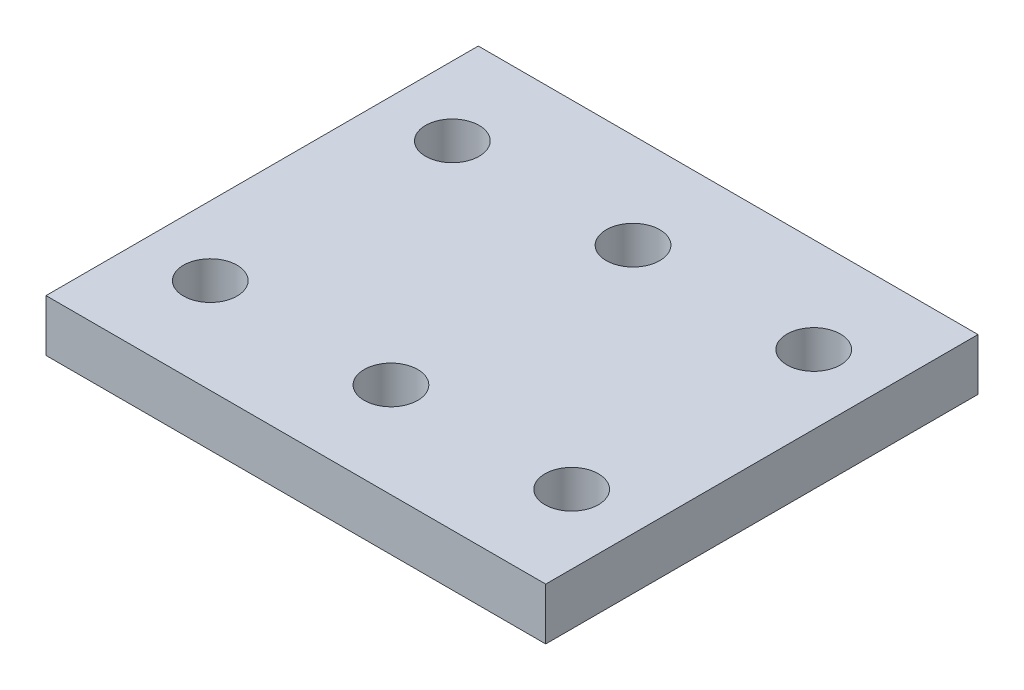
ISO-10303-21;
HEADER;
FILE_DESCRIPTION(('STEP AP214'),'2;1');
FILE_NAME('part.step','',(''),(''),'','','');
FILE_SCHEMA(('AUTOMOTIVE_DESIGN { 1 0 10303 214 1 1 1 1 }'));
ENDSEC;
DATA;
#1=APPLICATION_CONTEXT('core data for automotive mechanical design processes');
#2=APPLICATION_PROTOCOL_DEFINITION('international standard','automotive_design',2000,#1);
#3=PRODUCT_CONTEXT('',#1,'mechanical');
#4=PRODUCT('Part','Part','',(#3));
#5=PRODUCT_RELATED_PRODUCT_CATEGORY('part','',(#4));
#6=PRODUCT_DEFINITION_FORMATION('','',#4);
#7=PRODUCT_DEFINITION_CONTEXT('part definition',#1,'design');
#8=PRODUCT_DEFINITION('design','',#6,#7);
#9=PRODUCT_DEFINITION_SHAPE('','',#8);
#10=(LENGTH_UNIT() NAMED_UNIT(*) SI_UNIT(.MILLI.,.METRE.));
#11=(NAMED_UNIT(*) PLANE_ANGLE_UNIT() SI_UNIT($,.RADIAN.));
#12=(NAMED_UNIT(*) SI_UNIT($,.STERADIAN.) SOLID_ANGLE_UNIT());
#13=UNCERTAINTY_MEASURE_WITH_UNIT(LENGTH_MEASURE(1.E-05),#10,'distance_accuracy_value','');
#14=(GEOMETRIC_REPRESENTATION_CONTEXT(3) GLOBAL_UNCERTAINTY_ASSIGNED_CONTEXT((#13)) GLOBAL_UNIT_ASSIGNED_CONTEXT((#10,
#11,#12)) REPRESENTATION_CONTEXT('',''));
#15=CARTESIAN_POINT('',(0.,0.,0.));
#16=DIRECTION('',(0.,0.,1.));
#17=DIRECTION('',(1.,0.,0.));
#18=AXIS2_PLACEMENT_3D('',#15,#16,#17);
#19=CARTESIAN_POINT('',(0.,3.,0.));
#20=DIRECTION('',(0.,1.,0.));
#21=DIRECTION('',(0.,0.,1.));
#22=AXIS2_PLACEMENT_3D('',#19,#20,#21);
#23=PLANE('',#22);
#24=CARTESIAN_POINT('',(0.,3.,-7.));
#25=DIRECTION('',(0.,1.,0.));
#26=DIRECTION('',(0.,0.,1.));
#27=AXIS2_PLACEMENT_3D('',#24,#25,#26);
#28=CIRCLE('',#27,1.55);
#29=CARTESIAN_POINT('',(0.,3.,-5.45));
#30=VERTEX_POINT('',#29);
#31=EDGE_CURVE('E134',#30,#30,#28,.T.);
#32=ORIENTED_EDGE('',*,*,#31,.F.);
#33=EDGE_LOOP('',(#32));
#34=FACE_BOUND('',#33,.T.);
#35=CARTESIAN_POINT('',(-10.45,3.,7.));
#36=DIRECTION('',(0.,1.,0.));
#37=DIRECTION('',(0.,0.,1.));
#38=AXIS2_PLACEMENT_3D('',#35,#36,#37);
#39=CIRCLE('',#38,1.55);
#40=CARTESIAN_POINT('',(-10.45,3.,8.55));
#41=VERTEX_POINT('',#40);
#42=EDGE_CURVE('E122',#41,#41,#39,.T.);
#43=ORIENTED_EDGE('',*,*,#42,.F.);
#44=EDGE_LOOP('',(#43));
#45=FACE_BOUND('',#44,.T.);
#46=CARTESIAN_POINT('',(10.45,3.,-7.));
#47=DIRECTION('',(0.,1.,0.));
#48=DIRECTION('',(0.,0.,1.));
#49=AXIS2_PLACEMENT_3D('',#46,#47,#48);
#50=CIRCLE('',#49,1.55);
#51=CARTESIAN_POINT('',(10.45,3.,-5.45));
#52=VERTEX_POINT('',#51);
#53=EDGE_CURVE('E101',#52,#52,#50,.T.);
#54=ORIENTED_EDGE('',*,*,#53,.F.);
#55=EDGE_LOOP('',(#54));
#56=FACE_BOUND('',#55,.T.);
#57=DIRECTION('',(0.,0.,1.));
#58=VECTOR('',#57,1.);
#59=CARTESIAN_POINT('',(-14.45,3.,12.5));
#60=LINE('',#59,#58);
#61=CARTESIAN_POINT('',(-14.45,3.,-12.5));
#62=VERTEX_POINT('',#61);
#63=CARTESIAN_POINT('',(-14.45,3.,12.5));
#64=VERTEX_POINT('',#63);
#65=EDGE_CURVE('E86',#62,#64,#60,.T.);
#66=ORIENTED_EDGE('',*,*,#65,.T.);
#67=DIRECTION('',(1.,0.,0.));
#68=VECTOR('',#67,1.);
#69=CARTESIAN_POINT('',(14.45,3.,12.5));
#70=LINE('',#69,#68);
#71=CARTESIAN_POINT('',(14.45,3.,12.5));
#72=VERTEX_POINT('',#71);
#73=EDGE_CURVE('E81',#64,#72,#70,.T.);
#74=ORIENTED_EDGE('',*,*,#73,.T.);
#75=DIRECTION('',(0.,0.,-1.));
#76=VECTOR('',#75,1.);
#77=CARTESIAN_POINT('',(14.45,3.,12.5));
#78=LINE('',#77,#76);
#79=CARTESIAN_POINT('',(14.45,3.,-12.5));
#80=VERTEX_POINT('',#79);
#81=EDGE_CURVE('E84',#72,#80,#78,.T.);
#82=ORIENTED_EDGE('',*,*,#81,.T.);
#83=DIRECTION('',(-1.,0.,0.));
#84=VECTOR('',#83,1.);
#85=CARTESIAN_POINT('',(14.45,3.,-12.5));
#86=LINE('',#85,#84);
#87=EDGE_CURVE('E51',#80,#62,#86,.T.);
#88=ORIENTED_EDGE('',*,*,#87,.T.);
#89=EDGE_LOOP('',(#66,#74,#82,#88));
#90=FACE_BOUND('',#89,.T.);
#91=CARTESIAN_POINT('',(10.45,3.,7.));
#92=DIRECTION('',(0.,1.,0.));
#93=DIRECTION('',(0.,0.,1.));
#94=AXIS2_PLACEMENT_3D('',#91,#92,#93);
#95=CIRCLE('',#94,1.55);
#96=CARTESIAN_POINT('',(10.45,3.,8.55));
#97=VERTEX_POINT('',#96);
#98=EDGE_CURVE('E116',#97,#97,#95,.T.);
#99=ORIENTED_EDGE('',*,*,#98,.F.);
#100=EDGE_LOOP('',(#99));
#101=FACE_BOUND('',#100,.T.);
#102=CARTESIAN_POINT('',(-10.45,3.,-7.));
#103=DIRECTION('',(0.,1.,0.));
#104=DIRECTION('',(0.,0.,1.));
#105=AXIS2_PLACEMENT_3D('',#102,#103,#104);
#106=CIRCLE('',#105,1.55);
#107=CARTESIAN_POINT('',(-10.45,3.,-5.45));
#108=VERTEX_POINT('',#107);
#109=EDGE_CURVE('E128',#108,#108,#106,.T.);
#110=ORIENTED_EDGE('',*,*,#109,.F.);
#111=EDGE_LOOP('',(#110));
#112=FACE_BOUND('',#111,.T.);
#113=CARTESIAN_POINT('',(0.,3.,7.));
#114=DIRECTION('',(0.,1.,0.));
#115=DIRECTION('',(0.,0.,1.));
#116=AXIS2_PLACEMENT_3D('',#113,#114,#115);
#117=CIRCLE('',#116,1.55);
#118=CARTESIAN_POINT('',(0.,3.,8.55));
#119=VERTEX_POINT('',#118);
#120=EDGE_CURVE('E140',#119,#119,#117,.T.);
#121=ORIENTED_EDGE('',*,*,#120,.F.);
#122=EDGE_LOOP('',(#121));
#123=FACE_BOUND('',#122,.T.);
#124=ADVANCED_FACE('F34',(#34,#45,#56,#90,#101,#112,#123),#23,.T.);
#125=CARTESIAN_POINT('',(0.,0.,0.));
#126=DIRECTION('',(0.,1.,0.));
#127=DIRECTION('',(0.,0.,1.));
#128=AXIS2_PLACEMENT_3D('',#125,#126,#127);
#129=PLANE('',#128);
#130=DIRECTION('',(0.,0.,1.));
#131=VECTOR('',#130,1.);
#132=CARTESIAN_POINT('',(-14.45,0.,12.5));
#133=LINE('',#132,#131);
#134=CARTESIAN_POINT('',(-14.45,0.,-12.5));
#135=VERTEX_POINT('',#134);
#136=CARTESIAN_POINT('',(-14.45,0.,12.5));
#137=VERTEX_POINT('',#136);
#138=EDGE_CURVE('E98',#135,#137,#133,.T.);
#139=ORIENTED_EDGE('',*,*,#138,.F.);
#140=DIRECTION('',(-1.,0.,0.));
#141=VECTOR('',#140,1.);
#142=CARTESIAN_POINT('',(14.45,0.,-12.5));
#143=LINE('',#142,#141);
#144=CARTESIAN_POINT('',(14.45,0.,-12.5));
#145=VERTEX_POINT('',#144);
#146=EDGE_CURVE('E74',#145,#135,#143,.T.);
#147=ORIENTED_EDGE('',*,*,#146,.F.);
#148=DIRECTION('',(0.,0.,-1.));
#149=VECTOR('',#148,1.);
#150=CARTESIAN_POINT('',(14.45,0.,12.5));
#151=LINE('',#150,#149);
#152=CARTESIAN_POINT('',(14.45,0.,12.5));
#153=VERTEX_POINT('',#152);
#154=EDGE_CURVE('E68',#153,#145,#151,.T.);
#155=ORIENTED_EDGE('',*,*,#154,.F.);
#156=DIRECTION('',(1.,0.,0.));
#157=VECTOR('',#156,1.);
#158=CARTESIAN_POINT('',(14.45,0.,12.5));
#159=LINE('',#158,#157);
#160=EDGE_CURVE('E90',#137,#153,#159,.T.);
#161=ORIENTED_EDGE('',*,*,#160,.F.);
#162=EDGE_LOOP('',(#139,#147,#155,#161));
#163=FACE_BOUND('',#162,.T.);
#164=CARTESIAN_POINT('',(10.45,0.,-7.));
#165=DIRECTION('',(0.,1.,0.));
#166=DIRECTION('',(0.,0.,1.));
#167=AXIS2_PLACEMENT_3D('',#164,#165,#166);
#168=CIRCLE('',#167,1.55);
#169=CARTESIAN_POINT('',(10.45,0.,-5.45));
#170=VERTEX_POINT('',#169);
#171=EDGE_CURVE('E113',#170,#170,#168,.T.);
#172=ORIENTED_EDGE('',*,*,#171,.T.);
#173=EDGE_LOOP('',(#172));
#174=FACE_BOUND('',#173,.T.);
#175=CARTESIAN_POINT('',(10.45,0.,7.));
#176=DIRECTION('',(0.,1.,0.));
#177=DIRECTION('',(0.,0.,1.));
#178=AXIS2_PLACEMENT_3D('',#175,#176,#177);
#179=CIRCLE('',#178,1.55);
#180=CARTESIAN_POINT('',(10.45,0.,8.55));
#181=VERTEX_POINT('',#180);
#182=EDGE_CURVE('E119',#181,#181,#179,.T.);
#183=ORIENTED_EDGE('',*,*,#182,.T.);
#184=EDGE_LOOP('',(#183));
#185=FACE_BOUND('',#184,.T.);
#186=CARTESIAN_POINT('',(-10.45,0.,7.));
#187=DIRECTION('',(0.,1.,0.));
#188=DIRECTION('',(0.,0.,1.));
#189=AXIS2_PLACEMENT_3D('',#186,#187,#188);
#190=CIRCLE('',#189,1.55);
#191=CARTESIAN_POINT('',(-10.45,0.,8.55));
#192=VERTEX_POINT('',#191);
#193=EDGE_CURVE('E125',#192,#192,#190,.T.);
#194=ORIENTED_EDGE('',*,*,#193,.T.);
#195=EDGE_LOOP('',(#194));
#196=FACE_BOUND('',#195,.T.);
#197=CARTESIAN_POINT('',(-10.45,0.,-7.));
#198=DIRECTION('',(0.,1.,0.));
#199=DIRECTION('',(0.,0.,1.));
#200=AXIS2_PLACEMENT_3D('',#197,#198,#199);
#201=CIRCLE('',#200,1.55);
#202=CARTESIAN_POINT('',(-10.45,0.,-5.45));
#203=VERTEX_POINT('',#202);
#204=EDGE_CURVE('E131',#203,#203,#201,.T.);
#205=ORIENTED_EDGE('',*,*,#204,.T.);
#206=EDGE_LOOP('',(#205));
#207=FACE_BOUND('',#206,.T.);
#208=CARTESIAN_POINT('',(0.,0.,-7.));
#209=DIRECTION('',(0.,1.,0.));
#210=DIRECTION('',(0.,0.,1.));
#211=AXIS2_PLACEMENT_3D('',#208,#209,#210);
#212=CIRCLE('',#211,1.55);
#213=CARTESIAN_POINT('',(0.,0.,-5.45));
#214=VERTEX_POINT('',#213);
#215=EDGE_CURVE('E137',#214,#214,#212,.T.);
#216=ORIENTED_EDGE('',*,*,#215,.T.);
#217=EDGE_LOOP('',(#216));
#218=FACE_BOUND('',#217,.T.);
#219=CARTESIAN_POINT('',(0.,0.,7.));
#220=DIRECTION('',(0.,1.,0.));
#221=DIRECTION('',(0.,0.,1.));
#222=AXIS2_PLACEMENT_3D('',#219,#220,#221);
#223=CIRCLE('',#222,1.55);
#224=CARTESIAN_POINT('',(0.,0.,8.55));
#225=VERTEX_POINT('',#224);
#226=EDGE_CURVE('E143',#225,#225,#223,.T.);
#227=ORIENTED_EDGE('',*,*,#226,.T.);
#228=EDGE_LOOP('',(#227));
#229=FACE_BOUND('',#228,.T.);
#230=ADVANCED_FACE('F109',(#163,#174,#185,#196,#207,#218,#229),#129,.F.);
#231=CARTESIAN_POINT('',(-14.45,3.,12.5));
#232=DIRECTION('',(1.,0.,0.));
#233=DIRECTION('',(0.,0.,-1.));
#234=AXIS2_PLACEMENT_3D('',#231,#232,#233);
#235=PLANE('',#234);
#236=ORIENTED_EDGE('',*,*,#138,.T.);
#237=DIRECTION('',(0.,-1.,0.));
#238=VECTOR('',#237,1.);
#239=CARTESIAN_POINT('',(-14.45,3.,12.5));
#240=LINE('',#239,#238);
#241=EDGE_CURVE('E11',#64,#137,#240,.T.);
#242=ORIENTED_EDGE('',*,*,#241,.F.);
#243=ORIENTED_EDGE('',*,*,#65,.F.);
#244=DIRECTION('',(0.,-1.,0.));
#245=VECTOR('',#244,1.);
#246=CARTESIAN_POINT('',(-14.45,3.,-12.5));
#247=LINE('',#246,#245);
#248=EDGE_CURVE('E94',#62,#135,#247,.T.);
#249=ORIENTED_EDGE('',*,*,#248,.T.);
#250=EDGE_LOOP('',(#236,#242,#243,#249));
#251=FACE_BOUND('',#250,.T.);
#252=ADVANCED_FACE('F36',(#251),#235,.F.);
#253=CARTESIAN_POINT('',(14.45,3.,12.5));
#254=DIRECTION('',(0.,0.,-1.));
#255=DIRECTION('',(-1.,0.,0.));
#256=AXIS2_PLACEMENT_3D('',#253,#254,#255);
#257=PLANE('',#256);
#258=ORIENTED_EDGE('',*,*,#160,.T.);
#259=DIRECTION('',(0.,-1.,0.));
#260=VECTOR('',#259,1.);
#261=CARTESIAN_POINT('',(14.45,3.,12.5));
#262=LINE('',#261,#260);
#263=EDGE_CURVE('E43',#72,#153,#262,.T.);
#264=ORIENTED_EDGE('',*,*,#263,.F.);
#265=ORIENTED_EDGE('',*,*,#73,.F.);
#266=ORIENTED_EDGE('',*,*,#241,.T.);
#267=EDGE_LOOP('',(#258,#264,#265,#266));
#268=FACE_BOUND('',#267,.T.);
#269=ADVANCED_FACE('F89',(#268),#257,.F.);
#270=CARTESIAN_POINT('',(14.45,3.,12.5));
#271=DIRECTION('',(-1.,0.,0.));
#272=DIRECTION('',(0.,0.,1.));
#273=AXIS2_PLACEMENT_3D('',#270,#271,#272);
#274=PLANE('',#273);
#275=ORIENTED_EDGE('',*,*,#154,.T.);
#276=DIRECTION('',(0.,-1.,0.));
#277=VECTOR('',#276,1.);
#278=CARTESIAN_POINT('',(14.45,3.,-12.5));
#279=LINE('',#278,#277);
#280=EDGE_CURVE('E91',#80,#145,#279,.T.);
#281=ORIENTED_EDGE('',*,*,#280,.F.);
#282=ORIENTED_EDGE('',*,*,#81,.F.);
#283=ORIENTED_EDGE('',*,*,#263,.T.);
#284=EDGE_LOOP('',(#275,#281,#282,#283));
#285=FACE_BOUND('',#284,.T.);
#286=ADVANCED_FACE('F92',(#285),#274,.F.);
#287=CARTESIAN_POINT('',(14.45,3.,-12.5));
#288=DIRECTION('',(0.,0.,1.));
#289=DIRECTION('',(1.,0.,0.));
#290=AXIS2_PLACEMENT_3D('',#287,#288,#289);
#291=PLANE('',#290);
#292=ORIENTED_EDGE('',*,*,#146,.T.);
#293=ORIENTED_EDGE('',*,*,#248,.F.);
#294=ORIENTED_EDGE('',*,*,#87,.F.);
#295=ORIENTED_EDGE('',*,*,#280,.T.);
#296=EDGE_LOOP('',(#292,#293,#294,#295));
#297=FACE_BOUND('',#296,.T.);
#298=ADVANCED_FACE('F106',(#297),#291,.F.);
#299=CARTESIAN_POINT('',(10.45,3.,-7.));
#300=DIRECTION('',(0.,-1.,0.));
#301=DIRECTION('',(0.,0.,-1.));
#302=AXIS2_PLACEMENT_3D('',#299,#300,#301);
#303=CYLINDRICAL_SURFACE('',#302,1.55);
#304=ORIENTED_EDGE('',*,*,#53,.T.);
#305=EDGE_LOOP('',(#304));
#306=FACE_BOUND('',#305,.T.);
#307=ORIENTED_EDGE('',*,*,#171,.F.);
#308=EDGE_LOOP('',(#307));
#309=FACE_BOUND('',#308,.T.);
#310=ADVANCED_FACE('F162',(#306,#309),#303,.F.);
#311=CARTESIAN_POINT('',(10.45,3.,7.));
#312=DIRECTION('',(0.,-1.,0.));
#313=DIRECTION('',(0.,0.,-1.));
#314=AXIS2_PLACEMENT_3D('',#311,#312,#313);
#315=CYLINDRICAL_SURFACE('',#314,1.55);
#316=ORIENTED_EDGE('',*,*,#98,.T.);
#317=EDGE_LOOP('',(#316));
#318=FACE_BOUND('',#317,.T.);
#319=ORIENTED_EDGE('',*,*,#182,.F.);
#320=EDGE_LOOP('',(#319));
#321=FACE_BOUND('',#320,.T.);
#322=ADVANCED_FACE('F208',(#318,#321),#315,.F.);
#323=CARTESIAN_POINT('',(-10.45,3.,7.));
#324=DIRECTION('',(0.,-1.,0.));
#325=DIRECTION('',(0.,0.,-1.));
#326=AXIS2_PLACEMENT_3D('',#323,#324,#325);
#327=CYLINDRICAL_SURFACE('',#326,1.55);
#328=ORIENTED_EDGE('',*,*,#42,.T.);
#329=EDGE_LOOP('',(#328));
#330=FACE_BOUND('',#329,.T.);
#331=ORIENTED_EDGE('',*,*,#193,.F.);
#332=EDGE_LOOP('',(#331));
#333=FACE_BOUND('',#332,.T.);
#334=ADVANCED_FACE('F216',(#330,#333),#327,.F.);
#335=CARTESIAN_POINT('',(-10.45,3.,-7.));
#336=DIRECTION('',(0.,-1.,0.));
#337=DIRECTION('',(0.,0.,-1.));
#338=AXIS2_PLACEMENT_3D('',#335,#336,#337);
#339=CYLINDRICAL_SURFACE('',#338,1.55);
#340=ORIENTED_EDGE('',*,*,#109,.T.);
#341=EDGE_LOOP('',(#340));
#342=FACE_BOUND('',#341,.T.);
#343=ORIENTED_EDGE('',*,*,#204,.F.);
#344=EDGE_LOOP('',(#343));
#345=FACE_BOUND('',#344,.T.);
#346=ADVANCED_FACE('F224',(#342,#345),#339,.F.);
#347=CARTESIAN_POINT('',(0.,3.,-7.));
#348=DIRECTION('',(0.,-1.,0.));
#349=DIRECTION('',(0.,0.,-1.));
#350=AXIS2_PLACEMENT_3D('',#347,#348,#349);
#351=CYLINDRICAL_SURFACE('',#350,1.55);
#352=ORIENTED_EDGE('',*,*,#31,.T.);
#353=EDGE_LOOP('',(#352));
#354=FACE_BOUND('',#353,.T.);
#355=ORIENTED_EDGE('',*,*,#215,.F.);
#356=EDGE_LOOP('',(#355));
#357=FACE_BOUND('',#356,.T.);
#358=ADVANCED_FACE('F233',(#354,#357),#351,.F.);
#359=CARTESIAN_POINT('',(0.,3.,7.));
#360=DIRECTION('',(0.,-1.,0.));
#361=DIRECTION('',(0.,0.,-1.));
#362=AXIS2_PLACEMENT_3D('',#359,#360,#361);
#363=CYLINDRICAL_SURFACE('',#362,1.55);
#364=ORIENTED_EDGE('',*,*,#120,.T.);
#365=EDGE_LOOP('',(#364));
#366=FACE_BOUND('',#365,.T.);
#367=ORIENTED_EDGE('',*,*,#226,.F.);
#368=EDGE_LOOP('',(#367));
#369=FACE_BOUND('',#368,.T.);
#370=ADVANCED_FACE('F149',(#366,#369),#363,.F.);
#371=CLOSED_SHELL('',(#124,#230,#252,#269,#286,#298,#310,#322,#334,#346,#358,#370));
#372=MANIFOLD_SOLID_BREP('B2',#371);
#373=ADVANCED_BREP_SHAPE_REPRESENTATION('',(#18,#372),#14);
#374=SHAPE_DEFINITION_REPRESENTATION(#9,#373);
ENDSEC;
END-ISO-10303-21;
